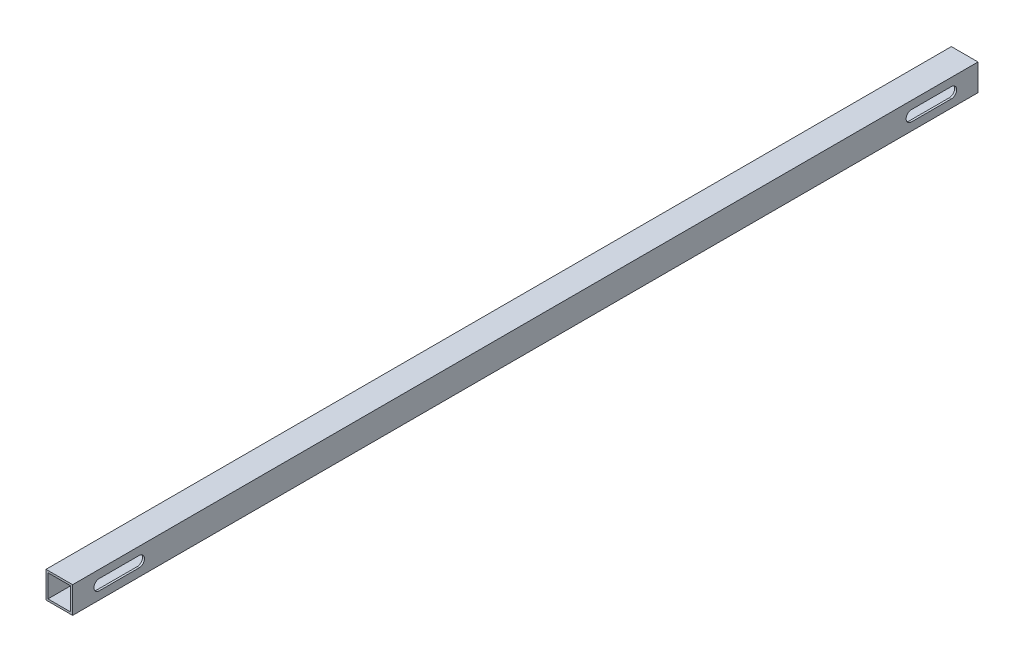
ISO-10303-21;
HEADER;
FILE_DESCRIPTION(('STEP AP214'),'2;1');
FILE_NAME('part.step','',(''),(''),'','','');
FILE_SCHEMA(('AUTOMOTIVE_DESIGN { 1 0 10303 214 1 1 1 1 }'));
ENDSEC;
DATA;
#1=APPLICATION_CONTEXT('core data for automotive mechanical design processes');
#2=APPLICATION_PROTOCOL_DEFINITION('international standard','automotive_design',2000,#1);
#3=PRODUCT_CONTEXT('',#1,'mechanical');
#4=PRODUCT('Part','Part','',(#3));
#5=PRODUCT_RELATED_PRODUCT_CATEGORY('part','',(#4));
#6=PRODUCT_DEFINITION_FORMATION('','',#4);
#7=PRODUCT_DEFINITION_CONTEXT('part definition',#1,'design');
#8=PRODUCT_DEFINITION('design','',#6,#7);
#9=PRODUCT_DEFINITION_SHAPE('','',#8);
#10=(LENGTH_UNIT() NAMED_UNIT(*) SI_UNIT(.MILLI.,.METRE.));
#11=(NAMED_UNIT(*) PLANE_ANGLE_UNIT() SI_UNIT($,.RADIAN.));
#12=(NAMED_UNIT(*) SI_UNIT($,.STERADIAN.) SOLID_ANGLE_UNIT());
#13=UNCERTAINTY_MEASURE_WITH_UNIT(LENGTH_MEASURE(1.E-05),#10,'distance_accuracy_value','');
#14=(GEOMETRIC_REPRESENTATION_CONTEXT(3) GLOBAL_UNCERTAINTY_ASSIGNED_CONTEXT((#13)) GLOBAL_UNIT_ASSIGNED_CONTEXT((#10,
#11,#12)) REPRESENTATION_CONTEXT('',''));
#15=CARTESIAN_POINT('',(0.,0.,0.));
#16=DIRECTION('',(0.,0.,1.));
#17=DIRECTION('',(1.,0.,0.));
#18=AXIS2_PLACEMENT_3D('',#15,#16,#17);
#19=CARTESIAN_POINT('',(0.,0.,680.));
#20=DIRECTION('',(0.,0.,1.));
#21=DIRECTION('',(1.,0.,0.));
#22=AXIS2_PLACEMENT_3D('',#19,#20,#21);
#23=PLANE('',#22);
#24=DIRECTION('',(0.,1.,0.));
#25=VECTOR('',#24,1.);
#26=CARTESIAN_POINT('',(9.99999999999999,10.,680.));
#27=LINE('',#26,#25);
#28=CARTESIAN_POINT('',(10.,-10.,680.));
#29=VERTEX_POINT('',#28);
#30=CARTESIAN_POINT('',(9.99999999999999,10.,680.));
#31=VERTEX_POINT('',#30);
#32=EDGE_CURVE('E325',#29,#31,#27,.T.);
#33=ORIENTED_EDGE('',*,*,#32,.T.);
#34=DIRECTION('',(-1.,0.,0.));
#35=VECTOR('',#34,1.);
#36=CARTESIAN_POINT('',(-10.,10.,680.));
#37=LINE('',#36,#35);
#38=CARTESIAN_POINT('',(-10.,10.,680.));
#39=VERTEX_POINT('',#38);
#40=EDGE_CURVE('E328',#31,#39,#37,.T.);
#41=ORIENTED_EDGE('',*,*,#40,.T.);
#42=DIRECTION('',(0.,-1.,0.));
#43=VECTOR('',#42,1.);
#44=CARTESIAN_POINT('',(-10.,10.,680.));
#45=LINE('',#44,#43);
#46=CARTESIAN_POINT('',(-10.,-10.,680.));
#47=VERTEX_POINT('',#46);
#48=EDGE_CURVE('E331',#39,#47,#45,.T.);
#49=ORIENTED_EDGE('',*,*,#48,.T.);
#50=DIRECTION('',(1.,0.,0.));
#51=VECTOR('',#50,1.);
#52=CARTESIAN_POINT('',(-10.,-10.,680.));
#53=LINE('',#52,#51);
#54=EDGE_CURVE('E333',#47,#29,#53,.T.);
#55=ORIENTED_EDGE('',*,*,#54,.T.);
#56=EDGE_LOOP('',(#33,#41,#49,#55));
#57=FACE_BOUND('',#56,.T.);
#58=DIRECTION('',(1.,0.,0.));
#59=VECTOR('',#58,1.);
#60=CARTESIAN_POINT('',(-8.50000000000001,-8.5,680.));
#61=LINE('',#60,#59);
#62=CARTESIAN_POINT('',(-8.50000000000001,-8.5,680.));
#63=VERTEX_POINT('',#62);
#64=CARTESIAN_POINT('',(8.49999999999999,-8.5,680.));
#65=VERTEX_POINT('',#64);
#66=EDGE_CURVE('E296',#63,#65,#61,.T.);
#67=ORIENTED_EDGE('',*,*,#66,.F.);
#68=DIRECTION('',(0.,-1.,0.));
#69=VECTOR('',#68,1.);
#70=CARTESIAN_POINT('',(-8.50000000000001,8.5,680.));
#71=LINE('',#70,#69);
#72=CARTESIAN_POINT('',(-8.50000000000001,8.5,680.));
#73=VERTEX_POINT('',#72);
#74=EDGE_CURVE('E294',#73,#63,#71,.T.);
#75=ORIENTED_EDGE('',*,*,#74,.F.);
#76=DIRECTION('',(-1.,0.,0.));
#77=VECTOR('',#76,1.);
#78=CARTESIAN_POINT('',(-8.50000000000001,8.5,680.));
#79=LINE('',#78,#77);
#80=CARTESIAN_POINT('',(8.49999999999999,8.5,680.));
#81=VERTEX_POINT('',#80);
#82=EDGE_CURVE('E302',#81,#73,#79,.T.);
#83=ORIENTED_EDGE('',*,*,#82,.F.);
#84=DIRECTION('',(0.,1.,0.));
#85=VECTOR('',#84,1.);
#86=CARTESIAN_POINT('',(8.49999999999999,8.5,680.));
#87=LINE('',#86,#85);
#88=EDGE_CURVE('E299',#65,#81,#87,.T.);
#89=ORIENTED_EDGE('',*,*,#88,.F.);
#90=EDGE_LOOP('',(#67,#75,#83,#89));
#91=FACE_BOUND('',#90,.T.);
#92=ADVANCED_FACE('F33',(#57,#91),#23,.T.);
#93=CARTESIAN_POINT('',(0.,0.,0.));
#94=DIRECTION('',(0.,0.,1.));
#95=DIRECTION('',(1.,0.,0.));
#96=AXIS2_PLACEMENT_3D('',#93,#94,#95);
#97=PLANE('',#96);
#98=DIRECTION('',(0.,1.,0.));
#99=VECTOR('',#98,1.);
#100=CARTESIAN_POINT('',(9.99999999999999,10.,0.));
#101=LINE('',#100,#99);
#102=CARTESIAN_POINT('',(10.,-10.,0.));
#103=VERTEX_POINT('',#102);
#104=CARTESIAN_POINT('',(9.99999999999999,10.,0.));
#105=VERTEX_POINT('',#104);
#106=EDGE_CURVE('E324',#103,#105,#101,.T.);
#107=ORIENTED_EDGE('',*,*,#106,.F.);
#108=DIRECTION('',(1.,0.,0.));
#109=VECTOR('',#108,1.);
#110=CARTESIAN_POINT('',(-10.,-10.,0.));
#111=LINE('',#110,#109);
#112=CARTESIAN_POINT('',(-10.,-10.,0.));
#113=VERTEX_POINT('',#112);
#114=EDGE_CURVE('E329',#113,#103,#111,.T.);
#115=ORIENTED_EDGE('',*,*,#114,.F.);
#116=DIRECTION('',(0.,-1.,0.));
#117=VECTOR('',#116,1.);
#118=CARTESIAN_POINT('',(-10.,10.,0.));
#119=LINE('',#118,#117);
#120=CARTESIAN_POINT('',(-10.,10.,0.));
#121=VERTEX_POINT('',#120);
#122=EDGE_CURVE('E340',#121,#113,#119,.T.);
#123=ORIENTED_EDGE('',*,*,#122,.F.);
#124=DIRECTION('',(-1.,0.,0.));
#125=VECTOR('',#124,1.);
#126=CARTESIAN_POINT('',(-10.,10.,0.));
#127=LINE('',#126,#125);
#128=EDGE_CURVE('E338',#105,#121,#127,.T.);
#129=ORIENTED_EDGE('',*,*,#128,.F.);
#130=EDGE_LOOP('',(#107,#115,#123,#129));
#131=FACE_BOUND('',#130,.T.);
#132=DIRECTION('',(0.,-1.,0.));
#133=VECTOR('',#132,1.);
#134=CARTESIAN_POINT('',(-8.50000000000001,8.5,0.));
#135=LINE('',#134,#133);
#136=CARTESIAN_POINT('',(-8.50000000000001,8.5,0.));
#137=VERTEX_POINT('',#136);
#138=CARTESIAN_POINT('',(-8.50000000000001,-8.5,0.));
#139=VERTEX_POINT('',#138);
#140=EDGE_CURVE('E293',#137,#139,#135,.T.);
#141=ORIENTED_EDGE('',*,*,#140,.T.);
#142=DIRECTION('',(1.,0.,0.));
#143=VECTOR('',#142,1.);
#144=CARTESIAN_POINT('',(-8.50000000000001,-8.5,0.));
#145=LINE('',#144,#143);
#146=CARTESIAN_POINT('',(8.49999999999999,-8.5,0.));
#147=VERTEX_POINT('',#146);
#148=EDGE_CURVE('E307',#139,#147,#145,.T.);
#149=ORIENTED_EDGE('',*,*,#148,.T.);
#150=DIRECTION('',(0.,1.,0.));
#151=VECTOR('',#150,1.);
#152=CARTESIAN_POINT('',(8.49999999999999,8.5,0.));
#153=LINE('',#152,#151);
#154=CARTESIAN_POINT('',(8.49999999999999,8.5,0.));
#155=VERTEX_POINT('',#154);
#156=EDGE_CURVE('E310',#147,#155,#153,.T.);
#157=ORIENTED_EDGE('',*,*,#156,.T.);
#158=DIRECTION('',(-1.,0.,0.));
#159=VECTOR('',#158,1.);
#160=CARTESIAN_POINT('',(-8.50000000000001,8.5,0.));
#161=LINE('',#160,#159);
#162=EDGE_CURVE('E297',#155,#137,#161,.T.);
#163=ORIENTED_EDGE('',*,*,#162,.T.);
#164=EDGE_LOOP('',(#141,#149,#157,#163));
#165=FACE_BOUND('',#164,.T.);
#166=ADVANCED_FACE('F389',(#131,#165),#97,.F.);
#167=CARTESIAN_POINT('',(9.99999999999999,10.,680.));
#168=DIRECTION('',(-1.,0.,0.));
#169=DIRECTION('',(0.,-1.,0.));
#170=AXIS2_PLACEMENT_3D('',#167,#168,#169);
#171=PLANE('',#170);
#172=DIRECTION('',(0.,0.,1.));
#173=VECTOR('',#172,1.);
#174=CARTESIAN_POINT('',(10.,-3.99999999999998,660.));
#175=LINE('',#174,#173);
#176=CARTESIAN_POINT('',(10.,-3.99999999999998,630.));
#177=VERTEX_POINT('',#176);
#178=CARTESIAN_POINT('',(10.,-3.99999999999998,660.));
#179=VERTEX_POINT('',#178);
#180=EDGE_CURVE('E216',#177,#179,#175,.T.);
#181=ORIENTED_EDGE('',*,*,#180,.T.);
#182=CARTESIAN_POINT('',(10.,0.,660.));
#183=DIRECTION('',(-1.,0.,0.));
#184=DIRECTION('',(0.,-1.,0.));
#185=AXIS2_PLACEMENT_3D('',#182,#183,#184);
#186=CIRCLE('',#185,4.);
#187=CARTESIAN_POINT('',(10.,4.00000000000001,660.));
#188=VERTEX_POINT('',#187);
#189=EDGE_CURVE('E200',#179,#188,#186,.T.);
#190=ORIENTED_EDGE('',*,*,#189,.T.);
#191=DIRECTION('',(0.,0.,-1.));
#192=VECTOR('',#191,1.);
#193=CARTESIAN_POINT('',(10.,4.00000000000001,660.));
#194=LINE('',#193,#192);
#195=CARTESIAN_POINT('',(10.,4.00000000000001,630.));
#196=VERTEX_POINT('',#195);
#197=EDGE_CURVE('E209',#188,#196,#194,.T.);
#198=ORIENTED_EDGE('',*,*,#197,.T.);
#199=CARTESIAN_POINT('',(10.,0.,630.));
#200=DIRECTION('',(-1.,0.,0.));
#201=DIRECTION('',(0.,-1.,0.));
#202=AXIS2_PLACEMENT_3D('',#199,#200,#201);
#203=CIRCLE('',#202,4.);
#204=EDGE_CURVE('E48',#196,#177,#203,.T.);
#205=ORIENTED_EDGE('',*,*,#204,.T.);
#206=EDGE_LOOP('',(#181,#190,#198,#205));
#207=FACE_BOUND('',#206,.T.);
#208=DIRECTION('',(0.,0.,-1.));
#209=VECTOR('',#208,1.);
#210=CARTESIAN_POINT('',(10.,4.00000000000001,20.));
#211=LINE('',#210,#209);
#212=CARTESIAN_POINT('',(10.,4.,50.));
#213=VERTEX_POINT('',#212);
#214=CARTESIAN_POINT('',(10.,4.00000000000001,20.));
#215=VERTEX_POINT('',#214);
#216=EDGE_CURVE('E250',#213,#215,#211,.T.);
#217=ORIENTED_EDGE('',*,*,#216,.T.);
#218=CARTESIAN_POINT('',(10.,0.,20.));
#219=DIRECTION('',(-1.,0.,0.));
#220=DIRECTION('',(0.,1.,0.));
#221=AXIS2_PLACEMENT_3D('',#218,#219,#220);
#222=CIRCLE('',#221,4.);
#223=CARTESIAN_POINT('',(10.,-3.99999999999999,20.));
#224=VERTEX_POINT('',#223);
#225=EDGE_CURVE('E242',#215,#224,#222,.T.);
#226=ORIENTED_EDGE('',*,*,#225,.T.);
#227=DIRECTION('',(0.,0.,1.));
#228=VECTOR('',#227,1.);
#229=CARTESIAN_POINT('',(10.,-3.99999999999999,20.));
#230=LINE('',#229,#228);
#231=CARTESIAN_POINT('',(10.,-4.,50.));
#232=VERTEX_POINT('',#231);
#233=EDGE_CURVE('E245',#224,#232,#230,.T.);
#234=ORIENTED_EDGE('',*,*,#233,.T.);
#235=CARTESIAN_POINT('',(10.,0.,50.));
#236=DIRECTION('',(-1.,0.,0.));
#237=DIRECTION('',(0.,1.,0.));
#238=AXIS2_PLACEMENT_3D('',#235,#236,#237);
#239=CIRCLE('',#238,4.);
#240=EDGE_CURVE('E56',#232,#213,#239,.T.);
#241=ORIENTED_EDGE('',*,*,#240,.T.);
#242=EDGE_LOOP('',(#217,#226,#234,#241));
#243=FACE_BOUND('',#242,.T.);
#244=ORIENTED_EDGE('',*,*,#106,.T.);
#245=DIRECTION('',(0.,0.,-1.));
#246=VECTOR('',#245,1.);
#247=CARTESIAN_POINT('',(9.99999999999999,10.,680.));
#248=LINE('',#247,#246);
#249=EDGE_CURVE('E351',#31,#105,#248,.T.);
#250=ORIENTED_EDGE('',*,*,#249,.F.);
#251=ORIENTED_EDGE('',*,*,#32,.F.);
#252=DIRECTION('',(0.,0.,-1.));
#253=VECTOR('',#252,1.);
#254=CARTESIAN_POINT('',(10.,-10.,680.));
#255=LINE('',#254,#253);
#256=EDGE_CURVE('E335',#29,#103,#255,.T.);
#257=ORIENTED_EDGE('',*,*,#256,.T.);
#258=EDGE_LOOP('',(#244,#250,#251,#257));
#259=FACE_BOUND('',#258,.T.);
#260=ADVANCED_FACE('F35',(#207,#243,#259),#171,.F.);
#261=CARTESIAN_POINT('',(-10.,10.,680.));
#262=DIRECTION('',(0.,-1.,0.));
#263=DIRECTION('',(0.,0.,-1.));
#264=AXIS2_PLACEMENT_3D('',#261,#262,#263);
#265=PLANE('',#264);
#266=ORIENTED_EDGE('',*,*,#128,.T.);
#267=DIRECTION('',(0.,0.,-1.));
#268=VECTOR('',#267,1.);
#269=CARTESIAN_POINT('',(-10.,10.,680.));
#270=LINE('',#269,#268);
#271=EDGE_CURVE('E348',#39,#121,#270,.T.);
#272=ORIENTED_EDGE('',*,*,#271,.F.);
#273=ORIENTED_EDGE('',*,*,#40,.F.);
#274=ORIENTED_EDGE('',*,*,#249,.T.);
#275=EDGE_LOOP('',(#266,#272,#273,#274));
#276=FACE_BOUND('',#275,.T.);
#277=ADVANCED_FACE('F408',(#276),#265,.F.);
#278=CARTESIAN_POINT('',(-10.,10.,680.));
#279=DIRECTION('',(1.,0.,0.));
#280=DIRECTION('',(0.,1.,0.));
#281=AXIS2_PLACEMENT_3D('',#278,#279,#280);
#282=PLANE('',#281);
#283=DIRECTION('',(0.,0.,-1.));
#284=VECTOR('',#283,1.);
#285=CARTESIAN_POINT('',(-10.,4.00000000000001,660.));
#286=LINE('',#285,#284);
#287=CARTESIAN_POINT('',(-10.,4.00000000000001,660.));
#288=VERTEX_POINT('',#287);
#289=CARTESIAN_POINT('',(-10.,4.00000000000001,630.));
#290=VERTEX_POINT('',#289);
#291=EDGE_CURVE('E227',#288,#290,#286,.T.);
#292=ORIENTED_EDGE('',*,*,#291,.F.);
#293=CARTESIAN_POINT('',(-10.,0.,660.));
#294=DIRECTION('',(-1.,0.,0.));
#295=DIRECTION('',(0.,-1.,0.));
#296=AXIS2_PLACEMENT_3D('',#293,#294,#295);
#297=CIRCLE('',#296,4.);
#298=CARTESIAN_POINT('',(-10.,-3.99999999999998,660.));
#299=VERTEX_POINT('',#298);
#300=EDGE_CURVE('E225',#299,#288,#297,.T.);
#301=ORIENTED_EDGE('',*,*,#300,.F.);
#302=DIRECTION('',(0.,0.,1.));
#303=VECTOR('',#302,1.);
#304=CARTESIAN_POINT('',(-10.,-3.99999999999998,660.));
#305=LINE('',#304,#303);
#306=CARTESIAN_POINT('',(-10.,-3.99999999999998,630.));
#307=VERTEX_POINT('',#306);
#308=EDGE_CURVE('E217',#307,#299,#305,.T.);
#309=ORIENTED_EDGE('',*,*,#308,.F.);
#310=CARTESIAN_POINT('',(-10.,0.,630.));
#311=DIRECTION('',(-1.,0.,0.));
#312=DIRECTION('',(0.,-1.,0.));
#313=AXIS2_PLACEMENT_3D('',#310,#311,#312);
#314=CIRCLE('',#313,4.);
#315=EDGE_CURVE('E220',#290,#307,#314,.T.);
#316=ORIENTED_EDGE('',*,*,#315,.F.);
#317=EDGE_LOOP('',(#292,#301,#309,#316));
#318=FACE_BOUND('',#317,.T.);
#319=DIRECTION('',(0.,0.,1.));
#320=VECTOR('',#319,1.);
#321=CARTESIAN_POINT('',(-10.,-4.,20.));
#322=LINE('',#321,#320);
#323=CARTESIAN_POINT('',(-10.,-4.,20.));
#324=VERTEX_POINT('',#323);
#325=CARTESIAN_POINT('',(-10.,-4.,50.));
#326=VERTEX_POINT('',#325);
#327=EDGE_CURVE('E256',#324,#326,#322,.T.);
#328=ORIENTED_EDGE('',*,*,#327,.F.);
#329=CARTESIAN_POINT('',(-10.,0.,20.));
#330=DIRECTION('',(-1.,0.,0.));
#331=DIRECTION('',(0.,1.,0.));
#332=AXIS2_PLACEMENT_3D('',#329,#330,#331);
#333=CIRCLE('',#332,4.);
#334=CARTESIAN_POINT('',(-10.,4.,20.));
#335=VERTEX_POINT('',#334);
#336=EDGE_CURVE('E254',#335,#324,#333,.T.);
#337=ORIENTED_EDGE('',*,*,#336,.F.);
#338=DIRECTION('',(0.,0.,-1.));
#339=VECTOR('',#338,1.);
#340=CARTESIAN_POINT('',(-10.,4.,20.));
#341=LINE('',#340,#339);
#342=CARTESIAN_POINT('',(-10.,4.,50.));
#343=VERTEX_POINT('',#342);
#344=EDGE_CURVE('E246',#343,#335,#341,.T.);
#345=ORIENTED_EDGE('',*,*,#344,.F.);
#346=CARTESIAN_POINT('',(-10.,0.,50.));
#347=DIRECTION('',(-1.,0.,0.));
#348=DIRECTION('',(0.,1.,0.));
#349=AXIS2_PLACEMENT_3D('',#346,#347,#348);
#350=CIRCLE('',#349,4.);
#351=EDGE_CURVE('E259',#326,#343,#350,.T.);
#352=ORIENTED_EDGE('',*,*,#351,.F.);
#353=EDGE_LOOP('',(#328,#337,#345,#352));
#354=FACE_BOUND('',#353,.T.);
#355=ORIENTED_EDGE('',*,*,#122,.T.);
#356=DIRECTION('',(0.,0.,-1.));
#357=VECTOR('',#356,1.);
#358=CARTESIAN_POINT('',(-10.,-10.,680.));
#359=LINE('',#358,#357);
#360=EDGE_CURVE('E345',#47,#113,#359,.T.);
#361=ORIENTED_EDGE('',*,*,#360,.F.);
#362=ORIENTED_EDGE('',*,*,#48,.F.);
#363=ORIENTED_EDGE('',*,*,#271,.T.);
#364=EDGE_LOOP('',(#355,#361,#362,#363));
#365=FACE_BOUND('',#364,.T.);
#366=ADVANCED_FACE('F405',(#318,#354,#365),#282,.F.);
#367=CARTESIAN_POINT('',(-10.,-10.,680.));
#368=DIRECTION('',(0.,1.,0.));
#369=DIRECTION('',(0.,0.,1.));
#370=AXIS2_PLACEMENT_3D('',#367,#368,#369);
#371=PLANE('',#370);
#372=ORIENTED_EDGE('',*,*,#114,.T.);
#373=ORIENTED_EDGE('',*,*,#256,.F.);
#374=ORIENTED_EDGE('',*,*,#54,.F.);
#375=ORIENTED_EDGE('',*,*,#360,.T.);
#376=EDGE_LOOP('',(#372,#373,#374,#375));
#377=FACE_BOUND('',#376,.T.);
#378=ADVANCED_FACE('F402',(#377),#371,.F.);
#379=CARTESIAN_POINT('',(-8.50000000000001,8.5,680.));
#380=DIRECTION('',(1.,0.,0.));
#381=DIRECTION('',(0.,0.,-1.));
#382=AXIS2_PLACEMENT_3D('',#379,#380,#381);
#383=PLANE('',#382);
#384=CARTESIAN_POINT('',(-8.50000000000001,0.,660.));
#385=DIRECTION('',(1.,0.,0.));
#386=DIRECTION('',(0.,0.,-1.));
#387=AXIS2_PLACEMENT_3D('',#384,#385,#386);
#388=CIRCLE('',#387,4.);
#389=CARTESIAN_POINT('',(-8.5,4.00000000000001,660.));
#390=VERTEX_POINT('',#389);
#391=CARTESIAN_POINT('',(-8.5,-3.99999999999998,660.));
#392=VERTEX_POINT('',#391);
#393=EDGE_CURVE('E291',#390,#392,#388,.T.);
#394=ORIENTED_EDGE('',*,*,#393,.F.);
#395=DIRECTION('',(0.,0.,1.));
#396=VECTOR('',#395,1.);
#397=CARTESIAN_POINT('',(-8.50000000000001,4.00000000000001,680.));
#398=LINE('',#397,#396);
#399=CARTESIAN_POINT('',(-8.50000000000001,4.00000000000001,630.));
#400=VERTEX_POINT('',#399);
#401=EDGE_CURVE('E284',#400,#390,#398,.T.);
#402=ORIENTED_EDGE('',*,*,#401,.F.);
#403=CARTESIAN_POINT('',(-8.50000000000001,0.,630.));
#404=DIRECTION('',(1.,0.,0.));
#405=DIRECTION('',(0.,0.,-1.));
#406=AXIS2_PLACEMENT_3D('',#403,#404,#405);
#407=CIRCLE('',#406,4.);
#408=CARTESIAN_POINT('',(-8.5,-3.99999999999998,630.));
#409=VERTEX_POINT('',#408);
#410=EDGE_CURVE('E286',#409,#400,#407,.T.);
#411=ORIENTED_EDGE('',*,*,#410,.F.);
#412=DIRECTION('',(0.,0.,-1.));
#413=VECTOR('',#412,1.);
#414=CARTESIAN_POINT('',(-8.50000000000001,-3.99999999999998,680.));
#415=LINE('',#414,#413);
#416=EDGE_CURVE('E289',#392,#409,#415,.T.);
#417=ORIENTED_EDGE('',*,*,#416,.F.);
#418=EDGE_LOOP('',(#394,#402,#411,#417));
#419=FACE_BOUND('',#418,.T.);
#420=CARTESIAN_POINT('',(-8.50000000000001,0.,20.));
#421=DIRECTION('',(1.,0.,0.));
#422=DIRECTION('',(0.,0.,-1.));
#423=AXIS2_PLACEMENT_3D('',#420,#421,#422);
#424=CIRCLE('',#423,4.);
#425=CARTESIAN_POINT('',(-8.5,-4.,20.));
#426=VERTEX_POINT('',#425);
#427=CARTESIAN_POINT('',(-8.5,4.,20.));
#428=VERTEX_POINT('',#427);
#429=EDGE_CURVE('E282',#426,#428,#424,.T.);
#430=ORIENTED_EDGE('',*,*,#429,.F.);
#431=DIRECTION('',(0.,0.,-1.));
#432=VECTOR('',#431,1.);
#433=CARTESIAN_POINT('',(-8.50000000000001,-4.00000000000009,680.));
#434=LINE('',#433,#432);
#435=CARTESIAN_POINT('',(-8.50000000000001,-4.,50.));
#436=VERTEX_POINT('',#435);
#437=EDGE_CURVE('E235',#436,#426,#434,.T.);
#438=ORIENTED_EDGE('',*,*,#437,.F.);
#439=CARTESIAN_POINT('',(-8.50000000000001,0.,50.));
#440=DIRECTION('',(1.,0.,0.));
#441=DIRECTION('',(0.,0.,-1.));
#442=AXIS2_PLACEMENT_3D('',#439,#440,#441);
#443=CIRCLE('',#442,4.);
#444=CARTESIAN_POINT('',(-8.5,4.,50.));
#445=VERTEX_POINT('',#444);
#446=EDGE_CURVE('E277',#445,#436,#443,.T.);
#447=ORIENTED_EDGE('',*,*,#446,.F.);
#448=DIRECTION('',(0.,0.,1.));
#449=VECTOR('',#448,1.);
#450=CARTESIAN_POINT('',(-8.50000000000001,3.99999999999995,680.));
#451=LINE('',#450,#449);
#452=EDGE_CURVE('E280',#428,#445,#451,.T.);
#453=ORIENTED_EDGE('',*,*,#452,.F.);
#454=EDGE_LOOP('',(#430,#438,#447,#453));
#455=FACE_BOUND('',#454,.T.);
#456=ORIENTED_EDGE('',*,*,#140,.F.);
#457=DIRECTION('',(0.,0.,-1.));
#458=VECTOR('',#457,1.);
#459=CARTESIAN_POINT('',(-8.50000000000001,8.5,680.));
#460=LINE('',#459,#458);
#461=EDGE_CURVE('E304',#73,#137,#460,.T.);
#462=ORIENTED_EDGE('',*,*,#461,.F.);
#463=ORIENTED_EDGE('',*,*,#74,.T.);
#464=DIRECTION('',(0.,0.,-1.));
#465=VECTOR('',#464,1.);
#466=CARTESIAN_POINT('',(-8.50000000000001,-8.5,680.));
#467=LINE('',#466,#465);
#468=EDGE_CURVE('E321',#63,#139,#467,.T.);
#469=ORIENTED_EDGE('',*,*,#468,.T.);
#470=EDGE_LOOP('',(#456,#462,#463,#469));
#471=FACE_BOUND('',#470,.T.);
#472=ADVANCED_FACE('F399',(#419,#455,#471),#383,.T.);
#473=CARTESIAN_POINT('',(-8.50000000000001,-8.5,680.));
#474=DIRECTION('',(0.,1.,0.));
#475=DIRECTION('',(-1.,0.,0.));
#476=AXIS2_PLACEMENT_3D('',#473,#474,#475);
#477=PLANE('',#476);
#478=ORIENTED_EDGE('',*,*,#148,.F.);
#479=ORIENTED_EDGE('',*,*,#468,.F.);
#480=ORIENTED_EDGE('',*,*,#66,.T.);
#481=DIRECTION('',(0.,0.,-1.));
#482=VECTOR('',#481,1.);
#483=CARTESIAN_POINT('',(8.49999999999999,-8.5,680.));
#484=LINE('',#483,#482);
#485=EDGE_CURVE('E319',#65,#147,#484,.T.);
#486=ORIENTED_EDGE('',*,*,#485,.T.);
#487=EDGE_LOOP('',(#478,#479,#480,#486));
#488=FACE_BOUND('',#487,.T.);
#489=ADVANCED_FACE('F439',(#488),#477,.T.);
#490=CARTESIAN_POINT('',(8.49999999999999,8.5,680.));
#491=DIRECTION('',(-1.,0.,0.));
#492=DIRECTION('',(0.,-1.,0.));
#493=AXIS2_PLACEMENT_3D('',#490,#491,#492);
#494=PLANE('',#493);
#495=CARTESIAN_POINT('',(8.49999999999999,0.,660.));
#496=DIRECTION('',(-1.,0.,0.));
#497=DIRECTION('',(0.,-1.,0.));
#498=AXIS2_PLACEMENT_3D('',#495,#496,#497);
#499=CIRCLE('',#498,4.);
#500=CARTESIAN_POINT('',(8.49999999999999,-3.99999999999998,660.));
#501=VERTEX_POINT('',#500);
#502=CARTESIAN_POINT('',(8.49999999999999,4.00000000000001,660.));
#503=VERTEX_POINT('',#502);
#504=EDGE_CURVE('E11',#501,#503,#499,.T.);
#505=ORIENTED_EDGE('',*,*,#504,.F.);
#506=DIRECTION('',(0.,0.,1.));
#507=VECTOR('',#506,1.);
#508=CARTESIAN_POINT('',(8.49999999999999,-3.99999999999998,680.));
#509=LINE('',#508,#507);
#510=CARTESIAN_POINT('',(8.49999999999999,-3.99999999999998,630.));
#511=VERTEX_POINT('',#510);
#512=EDGE_CURVE('E41',#511,#501,#509,.T.);
#513=ORIENTED_EDGE('',*,*,#512,.F.);
#514=CARTESIAN_POINT('',(8.49999999999999,0.,630.));
#515=DIRECTION('',(-1.,0.,0.));
#516=DIRECTION('',(0.,-1.,0.));
#517=AXIS2_PLACEMENT_3D('',#514,#515,#516);
#518=CIRCLE('',#517,4.);
#519=CARTESIAN_POINT('',(8.49999999999999,4.00000000000001,630.));
#520=VERTEX_POINT('',#519);
#521=EDGE_CURVE('E365',#520,#511,#518,.T.);
#522=ORIENTED_EDGE('',*,*,#521,.F.);
#523=DIRECTION('',(0.,0.,-1.));
#524=VECTOR('',#523,1.);
#525=CARTESIAN_POINT('',(8.49999999999999,4.00000000000001,680.));
#526=LINE('',#525,#524);
#527=EDGE_CURVE('E363',#503,#520,#526,.T.);
#528=ORIENTED_EDGE('',*,*,#527,.F.);
#529=EDGE_LOOP('',(#505,#513,#522,#528));
#530=FACE_BOUND('',#529,.T.);
#531=CARTESIAN_POINT('',(8.49999999999999,0.,20.));
#532=DIRECTION('',(-1.,0.,0.));
#533=DIRECTION('',(0.,-1.,0.));
#534=AXIS2_PLACEMENT_3D('',#531,#532,#533);
#535=CIRCLE('',#534,4.);
#536=CARTESIAN_POINT('',(8.49999999999999,4.00000000000001,20.));
#537=VERTEX_POINT('',#536);
#538=CARTESIAN_POINT('',(8.49999999999999,-3.99999999999999,20.));
#539=VERTEX_POINT('',#538);
#540=EDGE_CURVE('E360',#537,#539,#535,.T.);
#541=ORIENTED_EDGE('',*,*,#540,.F.);
#542=DIRECTION('',(0.,0.,-1.));
#543=VECTOR('',#542,1.);
#544=CARTESIAN_POINT('',(8.49999999999999,3.99999999999995,680.));
#545=LINE('',#544,#543);
#546=CARTESIAN_POINT('',(8.49999999999999,4.,50.));
#547=VERTEX_POINT('',#546);
#548=EDGE_CURVE('E358',#547,#537,#545,.T.);
#549=ORIENTED_EDGE('',*,*,#548,.F.);
#550=CARTESIAN_POINT('',(8.49999999999999,0.,50.));
#551=DIRECTION('',(-1.,0.,0.));
#552=DIRECTION('',(0.,-1.,0.));
#553=AXIS2_PLACEMENT_3D('',#550,#551,#552);
#554=CIRCLE('',#553,4.);
#555=CARTESIAN_POINT('',(8.49999999999999,-4.,50.));
#556=VERTEX_POINT('',#555);
#557=EDGE_CURVE('E356',#556,#547,#554,.T.);
#558=ORIENTED_EDGE('',*,*,#557,.F.);
#559=DIRECTION('',(0.,0.,1.));
#560=VECTOR('',#559,1.);
#561=CARTESIAN_POINT('',(8.49999999999999,-4.00000000000009,680.));
#562=LINE('',#561,#560);
#563=EDGE_CURVE('E354',#539,#556,#562,.T.);
#564=ORIENTED_EDGE('',*,*,#563,.F.);
#565=EDGE_LOOP('',(#541,#549,#558,#564));
#566=FACE_BOUND('',#565,.T.);
#567=ORIENTED_EDGE('',*,*,#156,.F.);
#568=ORIENTED_EDGE('',*,*,#485,.F.);
#569=ORIENTED_EDGE('',*,*,#88,.T.);
#570=DIRECTION('',(0.,0.,-1.));
#571=VECTOR('',#570,1.);
#572=CARTESIAN_POINT('',(8.49999999999999,8.5,680.));
#573=LINE('',#572,#571);
#574=EDGE_CURVE('E317',#81,#155,#573,.T.);
#575=ORIENTED_EDGE('',*,*,#574,.T.);
#576=EDGE_LOOP('',(#567,#568,#569,#575));
#577=FACE_BOUND('',#576,.T.);
#578=ADVANCED_FACE('F371',(#530,#566,#577),#494,.T.);
#579=CARTESIAN_POINT('',(-8.50000000000001,8.5,680.));
#580=DIRECTION('',(0.,-1.,0.));
#581=DIRECTION('',(0.,0.,-1.));
#582=AXIS2_PLACEMENT_3D('',#579,#580,#581);
#583=PLANE('',#582);
#584=ORIENTED_EDGE('',*,*,#162,.F.);
#585=ORIENTED_EDGE('',*,*,#574,.F.);
#586=ORIENTED_EDGE('',*,*,#82,.T.);
#587=ORIENTED_EDGE('',*,*,#461,.T.);
#588=EDGE_LOOP('',(#584,#585,#586,#587));
#589=FACE_BOUND('',#588,.T.);
#590=ADVANCED_FACE('F434',(#589),#583,.T.);
#591=CARTESIAN_POINT('',(10.,-3.99999999999999,20.));
#592=DIRECTION('',(0.,-1.,0.));
#593=DIRECTION('',(1.,0.,0.));
#594=AXIS2_PLACEMENT_3D('',#591,#592,#593);
#595=PLANE('',#594);
#596=ORIENTED_EDGE('',*,*,#563,.T.);
#597=DIRECTION('',(-1.,0.,0.));
#598=VECTOR('',#597,1.);
#599=CARTESIAN_POINT('',(10.,-4.,50.));
#600=LINE('',#599,#598);
#601=EDGE_CURVE('E271',#232,#556,#600,.T.);
#602=ORIENTED_EDGE('',*,*,#601,.F.);
#603=ORIENTED_EDGE('',*,*,#233,.F.);
#604=DIRECTION('',(-1.,0.,0.));
#605=VECTOR('',#604,1.);
#606=CARTESIAN_POINT('',(10.,-3.99999999999999,20.));
#607=LINE('',#606,#605);
#608=EDGE_CURVE('E274',#224,#539,#607,.T.);
#609=ORIENTED_EDGE('',*,*,#608,.T.);
#610=EDGE_LOOP('',(#596,#602,#603,#609));
#611=FACE_BOUND('',#610,.T.);
#612=ADVANCED_FACE('F449',(#611),#595,.F.);
#613=CARTESIAN_POINT('',(10.,0.,50.));
#614=DIRECTION('',(-1.,0.,0.));
#615=DIRECTION('',(0.,-1.,0.));
#616=AXIS2_PLACEMENT_3D('',#613,#614,#615);
#617=CYLINDRICAL_SURFACE('',#616,4.);
#618=ORIENTED_EDGE('',*,*,#557,.T.);
#619=DIRECTION('',(-1.,0.,0.));
#620=VECTOR('',#619,1.);
#621=CARTESIAN_POINT('',(10.,4.,50.));
#622=LINE('',#621,#620);
#623=EDGE_CURVE('E267',#213,#547,#622,.T.);
#624=ORIENTED_EDGE('',*,*,#623,.F.);
#625=ORIENTED_EDGE('',*,*,#240,.F.);
#626=ORIENTED_EDGE('',*,*,#601,.T.);
#627=EDGE_LOOP('',(#618,#624,#625,#626));
#628=FACE_BOUND('',#627,.T.);
#629=ADVANCED_FACE('F459',(#628),#617,.F.);
#630=CARTESIAN_POINT('',(10.,4.00000000000001,20.));
#631=DIRECTION('',(0.,1.,0.));
#632=DIRECTION('',(-1.,0.,0.));
#633=AXIS2_PLACEMENT_3D('',#630,#631,#632);
#634=PLANE('',#633);
#635=ORIENTED_EDGE('',*,*,#548,.T.);
#636=DIRECTION('',(-1.,0.,0.));
#637=VECTOR('',#636,1.);
#638=CARTESIAN_POINT('',(10.,4.00000000000001,20.));
#639=LINE('',#638,#637);
#640=EDGE_CURVE('E228',#215,#537,#639,.T.);
#641=ORIENTED_EDGE('',*,*,#640,.F.);
#642=ORIENTED_EDGE('',*,*,#216,.F.);
#643=ORIENTED_EDGE('',*,*,#623,.T.);
#644=EDGE_LOOP('',(#635,#641,#642,#643));
#645=FACE_BOUND('',#644,.T.);
#646=ADVANCED_FACE('F454',(#645),#634,.F.);
#647=CARTESIAN_POINT('',(10.,0.,20.));
#648=DIRECTION('',(-1.,0.,0.));
#649=DIRECTION('',(0.,-1.,0.));
#650=AXIS2_PLACEMENT_3D('',#647,#648,#649);
#651=CYLINDRICAL_SURFACE('',#650,4.);
#652=ORIENTED_EDGE('',*,*,#540,.T.);
#653=ORIENTED_EDGE('',*,*,#608,.F.);
#654=ORIENTED_EDGE('',*,*,#225,.F.);
#655=ORIENTED_EDGE('',*,*,#640,.T.);
#656=EDGE_LOOP('',(#652,#653,#654,#655));
#657=FACE_BOUND('',#656,.T.);
#658=ADVANCED_FACE('F383',(#657),#651,.F.);
#659=CARTESIAN_POINT('',(10.,4.00000000000001,660.));
#660=DIRECTION('',(0.,1.,0.));
#661=DIRECTION('',(-1.,0.,0.));
#662=AXIS2_PLACEMENT_3D('',#659,#660,#661);
#663=PLANE('',#662);
#664=ORIENTED_EDGE('',*,*,#527,.T.);
#665=DIRECTION('',(-1.,0.,0.));
#666=VECTOR('',#665,1.);
#667=CARTESIAN_POINT('',(10.,4.00000000000001,630.));
#668=LINE('',#667,#666);
#669=EDGE_CURVE('E211',#196,#520,#668,.T.);
#670=ORIENTED_EDGE('',*,*,#669,.F.);
#671=ORIENTED_EDGE('',*,*,#197,.F.);
#672=DIRECTION('',(-1.,0.,0.));
#673=VECTOR('',#672,1.);
#674=CARTESIAN_POINT('',(10.,4.00000000000001,660.));
#675=LINE('',#674,#673);
#676=EDGE_CURVE('E195',#188,#503,#675,.T.);
#677=ORIENTED_EDGE('',*,*,#676,.T.);
#678=EDGE_LOOP('',(#664,#670,#671,#677));
#679=FACE_BOUND('',#678,.T.);
#680=ADVANCED_FACE('F210',(#679),#663,.F.);
#681=CARTESIAN_POINT('',(10.,0.,630.));
#682=DIRECTION('',(-1.,0.,0.));
#683=DIRECTION('',(0.,-1.,0.));
#684=AXIS2_PLACEMENT_3D('',#681,#682,#683);
#685=CYLINDRICAL_SURFACE('',#684,4.);
#686=ORIENTED_EDGE('',*,*,#521,.T.);
#687=DIRECTION('',(-1.,0.,0.));
#688=VECTOR('',#687,1.);
#689=CARTESIAN_POINT('',(10.,-3.99999999999998,630.));
#690=LINE('',#689,#688);
#691=EDGE_CURVE('E237',#177,#511,#690,.T.);
#692=ORIENTED_EDGE('',*,*,#691,.F.);
#693=ORIENTED_EDGE('',*,*,#204,.F.);
#694=ORIENTED_EDGE('',*,*,#669,.T.);
#695=EDGE_LOOP('',(#686,#692,#693,#694));
#696=FACE_BOUND('',#695,.T.);
#697=ADVANCED_FACE('F373',(#696),#685,.F.);
#698=CARTESIAN_POINT('',(10.,-3.99999999999998,660.));
#699=DIRECTION('',(0.,-1.,0.));
#700=DIRECTION('',(1.,0.,0.));
#701=AXIS2_PLACEMENT_3D('',#698,#699,#700);
#702=PLANE('',#701);
#703=ORIENTED_EDGE('',*,*,#512,.T.);
#704=DIRECTION('',(-1.,0.,0.));
#705=VECTOR('',#704,1.);
#706=CARTESIAN_POINT('',(10.,-3.99999999999998,660.));
#707=LINE('',#706,#705);
#708=EDGE_CURVE('E233',#179,#501,#707,.T.);
#709=ORIENTED_EDGE('',*,*,#708,.F.);
#710=ORIENTED_EDGE('',*,*,#180,.F.);
#711=ORIENTED_EDGE('',*,*,#691,.T.);
#712=EDGE_LOOP('',(#703,#709,#710,#711));
#713=FACE_BOUND('',#712,.T.);
#714=ADVANCED_FACE('F368',(#713),#702,.F.);
#715=CARTESIAN_POINT('',(10.,0.,660.));
#716=DIRECTION('',(-1.,0.,0.));
#717=DIRECTION('',(0.,-1.,0.));
#718=AXIS2_PLACEMENT_3D('',#715,#716,#717);
#719=CYLINDRICAL_SURFACE('',#718,4.);
#720=ORIENTED_EDGE('',*,*,#504,.T.);
#721=ORIENTED_EDGE('',*,*,#676,.F.);
#722=ORIENTED_EDGE('',*,*,#189,.F.);
#723=ORIENTED_EDGE('',*,*,#708,.T.);
#724=EDGE_LOOP('',(#720,#721,#722,#723));
#725=FACE_BOUND('',#724,.T.);
#726=ADVANCED_FACE('F197',(#725),#719,.F.);
#727=ORIENTED_EDGE('',*,*,#429,.T.);
#728=EDGE_CURVE('E266',#428,#335,#639,.T.);
#729=ORIENTED_EDGE('',*,*,#728,.T.);
#730=ORIENTED_EDGE('',*,*,#336,.T.);
#731=EDGE_CURVE('E253',#426,#324,#607,.T.);
#732=ORIENTED_EDGE('',*,*,#731,.F.);
#733=EDGE_LOOP('',(#727,#729,#730,#732));
#734=FACE_BOUND('',#733,.T.);
#735=ADVANCED_FACE('F456',(#734),#651,.F.);
#736=ORIENTED_EDGE('',*,*,#452,.T.);
#737=EDGE_CURVE('E270',#445,#343,#622,.T.);
#738=ORIENTED_EDGE('',*,*,#737,.T.);
#739=ORIENTED_EDGE('',*,*,#344,.T.);
#740=ORIENTED_EDGE('',*,*,#728,.F.);
#741=EDGE_LOOP('',(#736,#738,#739,#740));
#742=FACE_BOUND('',#741,.T.);
#743=ADVANCED_FACE('F468',(#742),#634,.F.);
#744=ORIENTED_EDGE('',*,*,#446,.T.);
#745=EDGE_CURVE('E273',#436,#326,#600,.T.);
#746=ORIENTED_EDGE('',*,*,#745,.T.);
#747=ORIENTED_EDGE('',*,*,#351,.T.);
#748=ORIENTED_EDGE('',*,*,#737,.F.);
#749=EDGE_LOOP('',(#744,#746,#747,#748));
#750=FACE_BOUND('',#749,.T.);
#751=ADVANCED_FACE('F464',(#750),#617,.F.);
#752=ORIENTED_EDGE('',*,*,#437,.T.);
#753=ORIENTED_EDGE('',*,*,#731,.T.);
#754=ORIENTED_EDGE('',*,*,#327,.T.);
#755=ORIENTED_EDGE('',*,*,#745,.F.);
#756=EDGE_LOOP('',(#752,#753,#754,#755));
#757=FACE_BOUND('',#756,.T.);
#758=ADVANCED_FACE('F461',(#757),#595,.F.);
#759=ORIENTED_EDGE('',*,*,#393,.T.);
#760=EDGE_CURVE('E236',#392,#299,#707,.T.);
#761=ORIENTED_EDGE('',*,*,#760,.T.);
#762=ORIENTED_EDGE('',*,*,#300,.T.);
#763=EDGE_CURVE('E206',#390,#288,#675,.T.);
#764=ORIENTED_EDGE('',*,*,#763,.F.);
#765=EDGE_LOOP('',(#759,#761,#762,#764));
#766=FACE_BOUND('',#765,.T.);
#767=ADVANCED_FACE('F470',(#766),#719,.F.);
#768=ORIENTED_EDGE('',*,*,#416,.T.);
#769=EDGE_CURVE('E240',#409,#307,#690,.T.);
#770=ORIENTED_EDGE('',*,*,#769,.T.);
#771=ORIENTED_EDGE('',*,*,#308,.T.);
#772=ORIENTED_EDGE('',*,*,#760,.F.);
#773=EDGE_LOOP('',(#768,#770,#771,#772));
#774=FACE_BOUND('',#773,.T.);
#775=ADVANCED_FACE('F382',(#774),#702,.F.);
#776=ORIENTED_EDGE('',*,*,#410,.T.);
#777=EDGE_CURVE('E205',#400,#290,#668,.T.);
#778=ORIENTED_EDGE('',*,*,#777,.T.);
#779=ORIENTED_EDGE('',*,*,#315,.T.);
#780=ORIENTED_EDGE('',*,*,#769,.F.);
#781=EDGE_LOOP('',(#776,#778,#779,#780));
#782=FACE_BOUND('',#781,.T.);
#783=ADVANCED_FACE('F376',(#782),#685,.F.);
#784=ORIENTED_EDGE('',*,*,#401,.T.);
#785=ORIENTED_EDGE('',*,*,#763,.T.);
#786=ORIENTED_EDGE('',*,*,#291,.T.);
#787=ORIENTED_EDGE('',*,*,#777,.F.);
#788=EDGE_LOOP('',(#784,#785,#786,#787));
#789=FACE_BOUND('',#788,.T.);
#790=ADVANCED_FACE('F385',(#789),#663,.F.);
#791=CLOSED_SHELL('',(#92,#166,#260,#277,#366,#378,#472,#489,#578,#590,#612,#629,#646,#658,#680,
#697,#714,#726,#735,#743,#751,#758,#767,#775,#783,#790));
#792=MANIFOLD_SOLID_BREP('B2',#791);
#793=ADVANCED_BREP_SHAPE_REPRESENTATION('',(#18,#792),#14);
#794=SHAPE_DEFINITION_REPRESENTATION(#9,#793);
ENDSEC;
END-ISO-10303-21;
